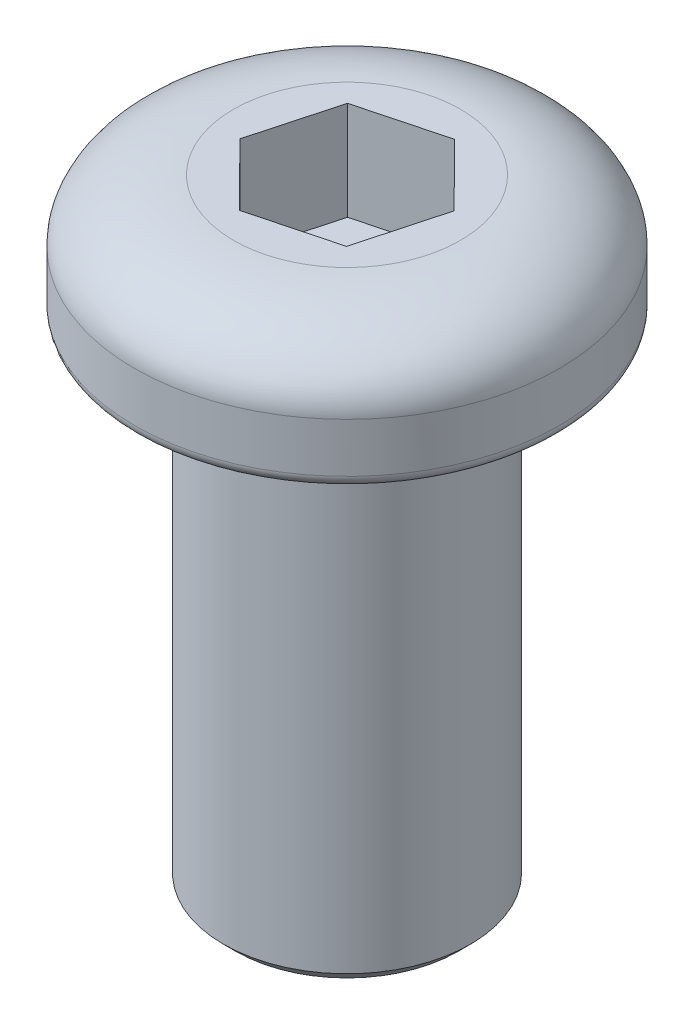
ISO-10303-21;
HEADER;
FILE_DESCRIPTION(('STEP AP214'),'2;1');
FILE_NAME('part.step','',(''),(''),'','','');
FILE_SCHEMA(('AUTOMOTIVE_DESIGN { 1 0 10303 214 1 1 1 1 }'));
ENDSEC;
DATA;
#1=APPLICATION_CONTEXT('core data for automotive mechanical design processes');
#2=APPLICATION_PROTOCOL_DEFINITION('international standard','automotive_design',2000,#1);
#3=PRODUCT_CONTEXT('',#1,'mechanical');
#4=PRODUCT('Part','Part','',(#3));
#5=PRODUCT_RELATED_PRODUCT_CATEGORY('part','',(#4));
#6=PRODUCT_DEFINITION_FORMATION('','',#4);
#7=PRODUCT_DEFINITION_CONTEXT('part definition',#1,'design');
#8=PRODUCT_DEFINITION('design','',#6,#7);
#9=PRODUCT_DEFINITION_SHAPE('','',#8);
#10=(LENGTH_UNIT() NAMED_UNIT(*) SI_UNIT(.MILLI.,.METRE.));
#11=(NAMED_UNIT(*) PLANE_ANGLE_UNIT() SI_UNIT($,.RADIAN.));
#12=(NAMED_UNIT(*) SI_UNIT($,.STERADIAN.) SOLID_ANGLE_UNIT());
#13=UNCERTAINTY_MEASURE_WITH_UNIT(LENGTH_MEASURE(1.E-05),#10,'distance_accuracy_value','');
#14=(GEOMETRIC_REPRESENTATION_CONTEXT(3) GLOBAL_UNCERTAINTY_ASSIGNED_CONTEXT((#13)) GLOBAL_UNIT_ASSIGNED_CONTEXT((#10,
#11,#12)) REPRESENTATION_CONTEXT('',''));
#15=CARTESIAN_POINT('',(0.,0.,0.));
#16=DIRECTION('',(0.,0.,1.));
#17=DIRECTION('',(1.,0.,0.));
#18=AXIS2_PLACEMENT_3D('',#15,#16,#17);
#19=CARTESIAN_POINT('',(0.,20.,0.));
#20=DIRECTION('',(0.,-1.,0.));
#21=DIRECTION('',(0.,0.,-1.));
#22=AXIS2_PLACEMENT_3D('',#19,#20,#21);
#23=CYLINDRICAL_SURFACE('',#22,5.);
#24=CARTESIAN_POINT('',(0.,0.5,0.));
#25=DIRECTION('',(0.,1.,0.));
#26=DIRECTION('',(0.,0.,1.));
#27=AXIS2_PLACEMENT_3D('',#24,#25,#26);
#28=CIRCLE('',#27,5.);
#29=CARTESIAN_POINT('',(0.,0.5,5.));
#30=VERTEX_POINT('',#29);
#31=EDGE_CURVE('E57',#30,#30,#28,.T.);
#32=ORIENTED_EDGE('',*,*,#31,.T.);
#33=EDGE_LOOP('',(#32));
#34=FACE_BOUND('',#33,.T.);
#35=CARTESIAN_POINT('',(0.,20.,0.));
#36=DIRECTION('',(0.,1.,0.));
#37=DIRECTION('',(0.,0.,1.));
#38=AXIS2_PLACEMENT_3D('',#35,#36,#37);
#39=CIRCLE('',#38,5.);
#40=CARTESIAN_POINT('',(0.,20.,5.));
#41=VERTEX_POINT('',#40);
#42=EDGE_CURVE('E155',#41,#41,#39,.T.);
#43=ORIENTED_EDGE('',*,*,#42,.F.);
#44=EDGE_LOOP('',(#43));
#45=FACE_BOUND('',#44,.T.);
#46=ADVANCED_FACE('F48',(#34,#45),#23,.T.);
#47=CARTESIAN_POINT('',(0.,0.,0.));
#48=DIRECTION('',(0.,1.,0.));
#49=DIRECTION('',(0.,0.,1.));
#50=AXIS2_PLACEMENT_3D('',#47,#48,#49);
#51=PLANE('',#50);
#52=CARTESIAN_POINT('',(0.,0.,0.));
#53=DIRECTION('',(0.,1.,0.));
#54=DIRECTION('',(0.,0.,1.));
#55=AXIS2_PLACEMENT_3D('',#52,#53,#54);
#56=CIRCLE('',#55,4.5);
#57=CARTESIAN_POINT('',(0.,0.,4.5));
#58=VERTEX_POINT('',#57);
#59=EDGE_CURVE('E13',#58,#58,#56,.F.);
#60=ORIENTED_EDGE('',*,*,#59,.T.);
#61=EDGE_LOOP('',(#60));
#62=FACE_BOUND('',#61,.T.);
#63=ADVANCED_FACE('F200',(#62),#51,.F.);
#64=CARTESIAN_POINT('',(0.,25.,0.));
#65=DIRECTION('',(0.,-1.,0.));
#66=DIRECTION('',(0.,0.,-1.));
#67=AXIS2_PLACEMENT_3D('',#64,#65,#66);
#68=CYLINDRICAL_SURFACE('',#67,8.6);
#69=CARTESIAN_POINT('',(0.,20.5,0.));
#70=DIRECTION('',(0.,1.,0.));
#71=DIRECTION('',(0.,0.,1.));
#72=AXIS2_PLACEMENT_3D('',#69,#70,#71);
#73=CIRCLE('',#72,8.6);
#74=CARTESIAN_POINT('',(0.,20.5,8.6));
#75=VERTEX_POINT('',#74);
#76=EDGE_CURVE('E311',#75,#75,#73,.T.);
#77=ORIENTED_EDGE('',*,*,#76,.T.);
#78=EDGE_LOOP('',(#77));
#79=FACE_BOUND('',#78,.T.);
#80=CARTESIAN_POINT('',(0.,22.5,8.6));
#81=CARTESIAN_POINT('',(1.125737358671,22.5,8.6));
#82=CARTESIAN_POINT('',(2.25103181368176,22.5,8.37616501595429));
#83=CARTESIAN_POINT('',(4.33112322299778,22.5,7.51456294323984));
#84=CARTESIAN_POINT('',(5.28510179805401,22.5,6.87713483835461));
#85=CARTESIAN_POINT('',(6.8771348383546,22.5,5.28510179805401));
#86=CARTESIAN_POINT('',(7.51456294323973,22.5,4.33112322299805));
#87=CARTESIAN_POINT('',(8.37616501595441,22.5,2.25103181368149));
#88=CARTESIAN_POINT('',(8.6,22.5,1.12573735866948));
#89=CARTESIAN_POINT('',(8.6,22.5,-1.12573735866948));
#90=CARTESIAN_POINT('',(8.37616501595424,22.5,-2.2510318136819));
#91=CARTESIAN_POINT('',(7.51456294323989,22.5,-4.33112322299765));
#92=CARTESIAN_POINT('',(6.87713483835462,22.5,-5.285101798054));
#93=CARTESIAN_POINT('',(5.28510179805399,22.5,-6.87713483835462));
#94=CARTESIAN_POINT('',(4.33112322299776,22.5,-7.51456294323984));
#95=CARTESIAN_POINT('',(2.2510318136818,22.5,-8.37616501595428));
#96=CARTESIAN_POINT('',(1.12573735866948,22.5,-8.6));
#97=CARTESIAN_POINT('',(-1.12573735866947,22.5,-8.6));
#98=CARTESIAN_POINT('',(-2.25103181368148,22.5,-8.37616501595441));
#99=CARTESIAN_POINT('',(-4.33112322299804,22.5,-7.51456294323973));
#100=CARTESIAN_POINT('',(-5.28510179805426,22.5,-6.87713483835436));
#101=CARTESIAN_POINT('',(-6.87713483835436,22.5,-5.28510179805425));
#102=CARTESIAN_POINT('',(-7.51456294323978,22.5,-4.3311232229979));
#103=CARTESIAN_POINT('',(-8.37616501595434,22.5,-2.25103181368166));
#104=CARTESIAN_POINT('',(-8.6,22.5,-1.12573735866946));
#105=CARTESIAN_POINT('',(-8.6,22.5,1.12573735866949));
#106=CARTESIAN_POINT('',(-8.3761650159543,22.5,2.25103181368175));
#107=CARTESIAN_POINT('',(-7.51456294323984,22.5,4.33112322299777));
#108=CARTESIAN_POINT('',(-6.87713483835444,22.5,5.28510179805417));
#109=CARTESIAN_POINT('',(-5.28510179805421,22.5,6.87713483835441));
#110=CARTESIAN_POINT('',(-4.33112322299779,22.5,7.51456294323983));
#111=CARTESIAN_POINT('',(-2.25103181368177,22.5,8.37616501595429));
#112=CARTESIAN_POINT('',(-1.125737358671,22.5,8.6));
#113=CARTESIAN_POINT('',(0.,22.5,8.6));
#114=(BOUNDED_CURVE() B_SPLINE_CURVE(3,(#80,#81,#82,#83,#84,#85,#86,#87,#88,#89,#90,#91,#92,#93,
#94,#95,#96,#97,#98,#99,#100,#101,#102,#103,#104,#105,#106,#107,#108,#109,#110,#111,#112,#113),
.UNSPECIFIED.,.T.,.F.) B_SPLINE_CURVE_WITH_KNOTS((4,2,2,2,2,2,2,2,2,2,2,2,2,2,2,2,4),(0.,
0.392699081698724,0.785398163397448,1.17809724509617,1.5707963267949,1.96349540849362,
2.35619449019234,2.74889357189107,3.14159265358979,3.53429173528852,3.92699081698724,
4.31968989868597,4.71238898038469,5.10508806208341,5.49778714378214,5.89048622548086,
6.28318530717959),
.UNSPECIFIED.) CURVE() GEOMETRIC_REPRESENTATION_ITEM() RATIONAL_B_SPLINE_CURVE((0.999999999999999,
0.999999999999999,0.999999999999999,0.999999999999999,0.999999999999999,0.999999999999999,
0.999999999999999,0.999999999999999,0.999999999999999,0.999999999999999,0.999999999999999,
0.999999999999999,0.999999999999999,0.999999999999999,0.999999999999999,0.999999999999999,
0.999999999999999,0.999999999999999,0.999999999999999,0.999999999999999,0.999999999999999,
0.999999999999999,0.999999999999999,0.999999999999999,0.999999999999999,0.999999999999999,
0.999999999999999,0.999999999999999,0.999999999999999,0.999999999999999,0.999999999999999,
0.999999999999999,0.999999999999999,0.999999999999999)) REPRESENTATION_ITEM(''));
#115=CARTESIAN_POINT('',(0.,22.5,8.6));
#116=VERTEX_POINT('',#115);
#117=EDGE_CURVE('E321',#116,#116,#114,.F.);
#118=ORIENTED_EDGE('',*,*,#117,.T.);
#119=EDGE_LOOP('',(#118));
#120=FACE_BOUND('',#119,.T.);
#121=ADVANCED_FACE('F189',(#79,#120),#68,.T.);
#122=CARTESIAN_POINT('',(0.,25.,0.));
#123=DIRECTION('',(0.,1.,0.));
#124=DIRECTION('',(0.,0.,1.));
#125=AXIS2_PLACEMENT_3D('',#122,#123,#124);
#126=PLANE('',#125);
#127=DIRECTION('',(0.966917920556033,0.,-0.255087700423987));
#128=VECTOR('',#127,1.);
#129=CARTESIAN_POINT('',(-0.932225060476934,25.,3.42614308466806));
#130=LINE('',#129,#128);
#131=CARTESIAN_POINT('',(-0.932225060476934,25.,3.42614308466806));
#132=VERTEX_POINT('',#131);
#133=CARTESIAN_POINT('',(2.50101441808445,25.,2.52040212675154));
#134=VERTEX_POINT('',#133);
#135=EDGE_CURVE('E64',#132,#134,#130,.T.);
#136=ORIENTED_EDGE('',*,*,#135,.F.);
#137=DIRECTION('',(0.704371389038143,0.,0.709831632363955));
#138=VECTOR('',#137,1.);
#139=CARTESIAN_POINT('',(-3.43323947856139,25.,0.905740957916521));
#140=LINE('',#139,#138);
#141=CARTESIAN_POINT('',(-3.43323947856139,25.,0.905740957916521));
#142=VERTEX_POINT('',#141);
#143=EDGE_CURVE('E151',#142,#132,#140,.T.);
#144=ORIENTED_EDGE('',*,*,#143,.F.);
#145=DIRECTION('',(-0.262546531517889,0.,0.964919332787941));
#146=VECTOR('',#145,1.);
#147=CARTESIAN_POINT('',(-2.50101441808445,25.,-2.52040212675154));
#148=LINE('',#147,#146);
#149=CARTESIAN_POINT('',(-2.50101441808445,25.,-2.52040212675154));
#150=VERTEX_POINT('',#149);
#151=EDGE_CURVE('E148',#150,#142,#148,.T.);
#152=ORIENTED_EDGE('',*,*,#151,.F.);
#153=DIRECTION('',(-0.966917920556033,0.,0.255087700423987));
#154=VECTOR('',#153,1.);
#155=CARTESIAN_POINT('',(0.932225060476934,25.,-3.42614308466806));
#156=LINE('',#155,#154);
#157=CARTESIAN_POINT('',(0.932225060476934,25.,-3.42614308466806));
#158=VERTEX_POINT('',#157);
#159=EDGE_CURVE('E112',#158,#150,#156,.T.);
#160=ORIENTED_EDGE('',*,*,#159,.F.);
#161=DIRECTION('',(-0.704371389038143,0.,-0.709831632363955));
#162=VECTOR('',#161,1.);
#163=CARTESIAN_POINT('',(3.43323947856139,25.,-0.905740957916521));
#164=LINE('',#163,#162);
#165=CARTESIAN_POINT('',(3.43323947856139,25.,-0.905740957916521));
#166=VERTEX_POINT('',#165);
#167=EDGE_CURVE('E144',#166,#158,#164,.T.);
#168=ORIENTED_EDGE('',*,*,#167,.F.);
#169=DIRECTION('',(0.262546531517889,0.,-0.964919332787941));
#170=VECTOR('',#169,1.);
#171=CARTESIAN_POINT('',(2.50101441808445,25.,2.52040212675154));
#172=LINE('',#171,#170);
#173=EDGE_CURVE('E141',#134,#166,#172,.T.);
#174=ORIENTED_EDGE('',*,*,#173,.F.);
#175=EDGE_LOOP('',(#136,#144,#152,#160,#168,#174));
#176=FACE_BOUND('',#175,.T.);
#177=CARTESIAN_POINT('',(0.,25.,4.6));
#178=CARTESIAN_POINT('',(-0.0752656575314665,25.,4.60000012177592));
#179=CARTESIAN_POINT('',(-0.150529809695449,25.,4.59812937693995));
#180=CARTESIAN_POINT('',(-0.30087351396799,25.,4.59068164564769));
#181=CARTESIAN_POINT('',(-0.375953069039884,25.,4.58510471908178));
#182=CARTESIAN_POINT('',(-0.525749785277858,25.,4.57027997990893));
#183=CARTESIAN_POINT('',(-0.600466939880982,25.,4.56103210107162));
#184=CARTESIAN_POINT('',(-0.749362114299666,25.,4.53890078901402));
#185=CARTESIAN_POINT('',(-0.823540124567928,25.,4.52601729157343));
#186=CARTESIAN_POINT('',(-0.971179967374798,25.,4.496649903959));
#187=CARTESIAN_POINT('',(-1.04464179991341,25.,4.48016601378515));
#188=CARTESIAN_POINT('',(-1.19067231721078,25.,4.44363294615111));
#189=CARTESIAN_POINT('',(-1.26324101772408,25.,4.42358383167683));
#190=CARTESIAN_POINT('',(-1.40730821199914,25.,4.37995544725056));
#191=CARTESIAN_POINT('',(-1.47880672504622,25.,4.35637624099701));
#192=CARTESIAN_POINT('',(-1.62055672479532,25.,4.30572276416426));
#193=CARTESIAN_POINT('',(-1.6908081913274,25.,4.27864843711288));
#194=CARTESIAN_POINT('',(-1.82987938643145,25.,4.22104326199095));
#195=CARTESIAN_POINT('',(-1.89869911500342,25.,4.1905124139204));
#196=CARTESIAN_POINT('',(-2.03474891811077,25.,4.12609744468302));
#197=CARTESIAN_POINT('',(-2.10197901831572,25.,4.09221337771035));
#198=CARTESIAN_POINT('',(-2.23469983442638,25.,4.02119241469102));
#199=CARTESIAN_POINT('',(-2.30019051892725,25.,3.98405545996599));
#200=CARTESIAN_POINT('',(-2.42928246928898,25.,3.90662906885067));
#201=CARTESIAN_POINT('',(-2.49288370175225,25.,3.86633957678241));
#202=CARTESIAN_POINT('',(-2.61804670925419,25.,3.78270832891208));
#203=CARTESIAN_POINT('',(-2.67960848429286,25.,3.73936657311001));
#204=CARTESIAN_POINT('',(-2.80054249297582,25.,3.64973095946562));
#205=CARTESIAN_POINT('',(-2.85991476527913,25.,3.60343715378569));
#206=CARTESIAN_POINT('',(-2.97631963684663,25.,3.50799765414422));
#207=CARTESIAN_POINT('',(-3.03335227830445,25.,3.4588520116522));
#208=CARTESIAN_POINT('',(-3.14492795559905,25.,3.35780892467047));
#209=CARTESIAN_POINT('',(-3.19947095119027,25.,3.30591143572598));
#210=CARTESIAN_POINT('',(-3.30591143572598,25.,3.19947095119024));
#211=CARTESIAN_POINT('',(-3.35780892467046,25.,3.144927955599));
#212=CARTESIAN_POINT('',(-3.45885201165217,25.,3.03335227830437));
#213=CARTESIAN_POINT('',(-3.50799765414418,25.,2.97631963684655));
#214=CARTESIAN_POINT('',(-3.60343715378565,25.,2.85991476527905));
#215=CARTESIAN_POINT('',(-3.64973095946558,25.,2.80054249297576));
#216=CARTESIAN_POINT('',(-3.73936657310996,25.,2.67960848429274));
#217=CARTESIAN_POINT('',(-3.78270832891202,25.,2.61804670925398));
#218=CARTESIAN_POINT('',(-3.86633957678239,25.,2.49288370175228));
#219=CARTESIAN_POINT('',(-3.9066290688507,25.,2.42928246928934));
#220=CARTESIAN_POINT('',(-3.98405545996591,25.,2.30019051892673));
#221=CARTESIAN_POINT('',(-4.02119241469077,25.,2.23469983442466));
#222=CARTESIAN_POINT('',(-4.09221337771058,25.,2.10197901831733));
#223=CARTESIAN_POINT('',(-4.12609744468388,25.,2.03474891811692));
#224=CARTESIAN_POINT('',(-4.19051241391954,25.,1.8986991149972));
#225=CARTESIAN_POINT('',(-4.22104326198772,25.,1.82987938640833));
#226=CARTESIAN_POINT('',(-4.27864843711612,25.,1.69080819135048));
#227=CARTESIAN_POINT('',(-4.30572276417634,25.,1.62055672488148));
#228=CARTESIAN_POINT('',(-4.35637624098494,25.,1.47880672495998));
#229=CARTESIAN_POINT('',(-4.3799554472055,25.,1.40730821167742));
#230=CARTESIAN_POINT('',(-4.4235838317219,25.,1.2632410180456));
#231=CARTESIAN_POINT('',(-4.44363294631931,25.,1.19067231841107));
#232=CARTESIAN_POINT('',(-4.48016601361695,25.,1.04464179871271));
#233=CARTESIAN_POINT('',(-4.49664990333126,25.,0.971179962894277));
#234=CARTESIAN_POINT('',(-4.52601729220118,25.,0.823540129047892));
#235=CARTESIAN_POINT('',(-4.5389007913568,25.,0.74936213101994));
#236=CARTESIAN_POINT('',(-4.56103209872888,25.,0.600466923160345));
#237=CARTESIAN_POINT('',(-4.57027997116578,25.,0.525749722877023));
#238=CARTESIAN_POINT('',(-4.58510472782477,25.,0.375953131438964));
#239=CARTESIAN_POINT('',(-4.5906816782767,25.,0.300873746843283));
#240=CARTESIAN_POINT('',(-4.59812934431042,25.,0.150529576815985));
#241=CARTESIAN_POINT('',(-4.6,25.,0.0752647884079963));
#242=CARTESIAN_POINT('',(-4.6,25.,-0.075264788407981));
#243=CARTESIAN_POINT('',(-4.59812934431042,25.,-0.150529576815969));
#244=CARTESIAN_POINT('',(-4.59068167827672,25.,-0.300873746843266));
#245=CARTESIAN_POINT('',(-4.58510472782479,25.,-0.375953131438945));
#246=CARTESIAN_POINT('',(-4.57027997116582,25.,-0.525749722877002));
#247=CARTESIAN_POINT('',(-4.56103209872893,25.,-0.600466923160323));
#248=CARTESIAN_POINT('',(-4.53890079135688,25.,-0.749362131019916));
#249=CARTESIAN_POINT('',(-4.52601729220127,25.,-0.823540129047868));
#250=CARTESIAN_POINT('',(-4.49664990333136,25.,-0.971179962894252));
#251=CARTESIAN_POINT('',(-4.48016601361706,25.,-1.04464179871269));
#252=CARTESIAN_POINT('',(-4.44363294631942,25.,-1.19067231841105));
#253=CARTESIAN_POINT('',(-4.42358383172201,25.,-1.26324101804558));
#254=CARTESIAN_POINT('',(-4.3799554472056,25.,-1.4073082116774));
#255=CARTESIAN_POINT('',(-4.35637624098503,25.,-1.47880672495997));
#256=CARTESIAN_POINT('',(-4.30572276417639,25.,-1.62055672488148));
#257=CARTESIAN_POINT('',(-4.27864843711614,25.,-1.69080819135048));
#258=CARTESIAN_POINT('',(-4.22104326198769,25.,-1.82987938640835));
#259=CARTESIAN_POINT('',(-4.19051241391948,25.,-1.89869911499722));
#260=CARTESIAN_POINT('',(-4.12609744468378,25.,-2.03474891811694));
#261=CARTESIAN_POINT('',(-4.09221337771047,25.,-2.10197901831735));
#262=CARTESIAN_POINT('',(-4.02119241469064,25.,-2.23469983442468));
#263=CARTESIAN_POINT('',(-3.98405545996578,25.,-2.30019051892675));
#264=CARTESIAN_POINT('',(-3.90662906885057,25.,-2.42928246928936));
#265=CARTESIAN_POINT('',(-3.86633957678226,25.,-2.49288370175229));
#266=CARTESIAN_POINT('',(-3.7827083289119,25.,-2.61804670925398));
#267=CARTESIAN_POINT('',(-3.73936657310986,25.,-2.67960848429273));
#268=CARTESIAN_POINT('',(-3.6497309594655,25.,-2.80054249297574));
#269=CARTESIAN_POINT('',(-3.60343715378558,25.,-2.85991476527903));
#270=CARTESIAN_POINT('',(-3.50799765414413,25.,-2.97631963684653));
#271=CARTESIAN_POINT('',(-3.45885201165213,25.,-3.03335227830436));
#272=CARTESIAN_POINT('',(-3.35780892467044,25.,-3.144927955599));
#273=CARTESIAN_POINT('',(-3.30591143572597,25.,-3.19947095119024));
#274=CARTESIAN_POINT('',(-3.19947095119027,25.,-3.30591143572599));
#275=CARTESIAN_POINT('',(-3.14492795559906,25.,-3.35780892467049));
#276=CARTESIAN_POINT('',(-3.03335227830446,25.,-3.45885201165222));
#277=CARTESIAN_POINT('',(-2.97631963684664,25.,-3.50799765414424));
#278=CARTESIAN_POINT('',(-2.85991476527915,25.,-3.6034371537857));
#279=CARTESIAN_POINT('',(-2.80054249297587,25.,-3.64973095946562));
#280=CARTESIAN_POINT('',(-2.67960848429285,25.,-3.73936657310998));
#281=CARTESIAN_POINT('',(-2.61804670925409,25.,-3.78270832891203));
#282=CARTESIAN_POINT('',(-2.49288370175239,25.,-3.86633957678238));
#283=CARTESIAN_POINT('',(-2.42928246928944,25.,-3.90662906885068));
#284=CARTESIAN_POINT('',(-2.30019051892682,25.,-3.98405545996586));
#285=CARTESIAN_POINT('',(-2.23469983442473,25.,-4.02119241469071));
#286=CARTESIAN_POINT('',(-2.10197901831738,25.,-4.09221337771052));
#287=CARTESIAN_POINT('',(-2.03474891811696,25.,-4.12609744468382));
#288=CARTESIAN_POINT('',(-1.89869911499722,25.,-4.1905124139195));
#289=CARTESIAN_POINT('',(-1.82987938640835,25.,-4.2210432619877));
#290=CARTESIAN_POINT('',(-1.69080819135047,25.,-4.27864843711614));
#291=CARTESIAN_POINT('',(-1.62055672488147,25.,-4.30572276417638));
#292=CARTESIAN_POINT('',(-1.47880672495996,25.,-4.35637624098501));
#293=CARTESIAN_POINT('',(-1.40730821167738,25.,-4.37995544720558));
#294=CARTESIAN_POINT('',(-1.26324101804557,25.,-4.423583831722));
#295=CARTESIAN_POINT('',(-1.19067231841103,25.,-4.4436329463194));
#296=CARTESIAN_POINT('',(-1.04464179871267,25.,-4.48016601361704));
#297=CARTESIAN_POINT('',(-0.971179962894238,25.,-4.49664990333134));
#298=CARTESIAN_POINT('',(-0.823540129047857,25.,-4.52601729220125));
#299=CARTESIAN_POINT('',(-0.749362131019907,25.,-4.53890079135686));
#300=CARTESIAN_POINT('',(-0.600466923160318,25.,-4.56103209872893));
#301=CARTESIAN_POINT('',(-0.525749722877001,25.,-4.57027997116582));
#302=CARTESIAN_POINT('',(-0.375953131438949,25.,-4.58510472782479));
#303=CARTESIAN_POINT('',(-0.30087374684327,25.,-4.59068167827672));
#304=CARTESIAN_POINT('',(-0.150529576815975,25.,-4.59812934431042));
#305=CARTESIAN_POINT('',(-0.0752647884079872,25.,-4.6));
#306=CARTESIAN_POINT('',(0.0752647884079895,25.,-4.6));
#307=CARTESIAN_POINT('',(0.150529576815978,25.,-4.59812934431042));
#308=CARTESIAN_POINT('',(0.300873746843277,25.,-4.5906816782767));
#309=CARTESIAN_POINT('',(0.375953131438958,25.,-4.58510472782476));
#310=CARTESIAN_POINT('',(0.525749722877017,25.,-4.57027997116577));
#311=CARTESIAN_POINT('',(0.600466923160337,25.,-4.56103209872887));
#312=CARTESIAN_POINT('',(0.749362131019932,25.,-4.53890079135678));
#313=CARTESIAN_POINT('',(0.823540129047885,25.,-4.52601729220116));
#314=CARTESIAN_POINT('',(0.971179962894271,25.,-4.49664990333123));
#315=CARTESIAN_POINT('',(1.0446417987127,25.,-4.48016601361693));
#316=CARTESIAN_POINT('',(1.19067231841107,25.,-4.44363294631928));
#317=CARTESIAN_POINT('',(1.2632410180456,25.,-4.42358383172188));
#318=CARTESIAN_POINT('',(1.40730821167742,25.,-4.37995544720548));
#319=CARTESIAN_POINT('',(1.47880672495999,25.,-4.35637624098491));
#320=CARTESIAN_POINT('',(1.62055672488149,25.,-4.30572276417632));
#321=CARTESIAN_POINT('',(1.69080819135049,25.,-4.27864843711611));
#322=CARTESIAN_POINT('',(1.82987938640835,25.,-4.22104326198772));
#323=CARTESIAN_POINT('',(1.89869911499722,25.,-4.19051241391955));
#324=CARTESIAN_POINT('',(2.03474891811693,25.,-4.1260974446839));
#325=CARTESIAN_POINT('',(2.10197901831734,25.,-4.0922133777106));
#326=CARTESIAN_POINT('',(2.23469983442467,25.,-4.0211924146908));
#327=CARTESIAN_POINT('',(2.30019051892674,25.,-3.98405545996595));
#328=CARTESIAN_POINT('',(2.42928246928934,25.,-3.90662906885075));
#329=CARTESIAN_POINT('',(2.49288370175228,25.,-3.86633957678243));
#330=CARTESIAN_POINT('',(2.61804670925397,25.,-3.78270832891206));
#331=CARTESIAN_POINT('',(2.67960848429272,25.,-3.73936657311));
#332=CARTESIAN_POINT('',(2.80054249297574,25.,-3.64973095946562));
#333=CARTESIAN_POINT('',(2.85991476527903,25.,-3.60343715378569));
#334=CARTESIAN_POINT('',(2.97631963684653,25.,-3.50799765414421));
#335=CARTESIAN_POINT('',(3.03335227830436,25.,-3.4588520116522));
#336=CARTESIAN_POINT('',(3.144927955599,25.,-3.35780892467048));
#337=CARTESIAN_POINT('',(3.19947095119024,25.,-3.30591143572598));
#338=CARTESIAN_POINT('',(3.30591143572599,25.,-3.19947095119026));
#339=CARTESIAN_POINT('',(3.3578089246705,25.,-3.14492795559903));
#340=CARTESIAN_POINT('',(3.45885201165224,25.,-3.0333522783044));
#341=CARTESIAN_POINT('',(3.50799765414426,25.,-2.97631963684658));
#342=CARTESIAN_POINT('',(3.60343715378574,25.,-2.85991476527908));
#343=CARTESIAN_POINT('',(3.64973095946568,25.,-2.80054249297578));
#344=CARTESIAN_POINT('',(3.73936657311006,25.,-2.67960848429276));
#345=CARTESIAN_POINT('',(3.78270832891211,25.,-2.618046709254));
#346=CARTESIAN_POINT('',(3.86633957678248,25.,-2.4928837017523));
#347=CARTESIAN_POINT('',(3.90662906885079,25.,-2.42928246928935));
#348=CARTESIAN_POINT('',(3.98405545996598,25.,-2.30019051892674));
#349=CARTESIAN_POINT('',(4.02119241469082,25.,-2.23469983442466));
#350=CARTESIAN_POINT('',(4.09221337771062,25.,-2.10197901831733));
#351=CARTESIAN_POINT('',(4.12609744468391,25.,-2.03474891811692));
#352=CARTESIAN_POINT('',(4.19051241391955,25.,-1.8986991149972));
#353=CARTESIAN_POINT('',(4.22104326198773,25.,-1.82987938640834));
#354=CARTESIAN_POINT('',(4.27864843711611,25.,-1.69080819135049));
#355=CARTESIAN_POINT('',(4.30572276417633,25.,-1.6205567248815));
#356=CARTESIAN_POINT('',(4.35637624098492,25.,-1.47880672496));
#357=CARTESIAN_POINT('',(4.37995544720548,25.,-1.40730821167744));
#358=CARTESIAN_POINT('',(4.42358383172188,25.,-1.26324101804563));
#359=CARTESIAN_POINT('',(4.44363294631928,25.,-1.19067231841109));
#360=CARTESIAN_POINT('',(4.48016601361693,25.,-1.04464179871273));
#361=CARTESIAN_POINT('',(4.49664990333123,25.,-0.971179962894294));
#362=CARTESIAN_POINT('',(4.52601729220116,25.,-0.823540129047904));
#363=CARTESIAN_POINT('',(4.53890079135678,25.,-0.749362131019949));
#364=CARTESIAN_POINT('',(4.56103209872887,25.,-0.60046692316035));
#365=CARTESIAN_POINT('',(4.57027997116577,25.,-0.525749722877027));
#366=CARTESIAN_POINT('',(4.58510472782476,25.,-0.375953131438964));
#367=CARTESIAN_POINT('',(4.5906816782767,25.,-0.300873746843281));
#368=CARTESIAN_POINT('',(4.59812934431042,25.,-0.15052957681598));
#369=CARTESIAN_POINT('',(4.6,25.,-0.0752647884079898));
#370=CARTESIAN_POINT('',(4.6,25.,0.0752647884079886));
#371=CARTESIAN_POINT('',(4.59812934431042,25.,0.150529576815977));
#372=CARTESIAN_POINT('',(4.5906816782767,25.,0.300873746843272));
#373=CARTESIAN_POINT('',(4.58510472782476,25.,0.37595313143895));
#374=CARTESIAN_POINT('',(4.57027997116577,25.,0.525749722877003));
#375=CARTESIAN_POINT('',(4.56103209872887,25.,0.600466923160321));
#376=CARTESIAN_POINT('',(4.53890079135678,25.,0.749362131019909));
#377=CARTESIAN_POINT('',(4.52601729220116,25.,0.823540129047859));
#378=CARTESIAN_POINT('',(4.49664990333123,25.,0.97117996289424));
#379=CARTESIAN_POINT('',(4.48016601361693,25.,1.04464179871267));
#380=CARTESIAN_POINT('',(4.44363294631928,25.,1.19067231841104));
#381=CARTESIAN_POINT('',(4.42358383172188,25.,1.26324101804557));
#382=CARTESIAN_POINT('',(4.37995544720548,25.,1.40730821167739));
#383=CARTESIAN_POINT('',(4.35637624098492,25.,1.47880672495996));
#384=CARTESIAN_POINT('',(4.30572276417633,25.,1.62055672488147));
#385=CARTESIAN_POINT('',(4.27864843711611,25.,1.69080819135047));
#386=CARTESIAN_POINT('',(4.22104326198773,25.,1.82987938640835));
#387=CARTESIAN_POINT('',(4.19051241391955,25.,1.89869911499722));
#388=CARTESIAN_POINT('',(4.1260974446839,25.,2.03474891811696));
#389=CARTESIAN_POINT('',(4.0922133777106,25.,2.10197901831737));
#390=CARTESIAN_POINT('',(4.02119241469079,25.,2.2346998344247));
#391=CARTESIAN_POINT('',(3.98405545996593,25.,2.30019051892678));
#392=CARTESIAN_POINT('',(3.90662906885072,25.,2.42928246928939));
#393=CARTESIAN_POINT('',(3.8663395767824,25.,2.49288370175233));
#394=CARTESIAN_POINT('',(3.78270832891203,25.,2.61804670925402));
#395=CARTESIAN_POINT('',(3.73936657310997,25.,2.67960848429278));
#396=CARTESIAN_POINT('',(3.64973095946558,25.,2.80054249297579));
#397=CARTESIAN_POINT('',(3.60343715378565,25.,2.85991476527908));
#398=CARTESIAN_POINT('',(3.50799765414418,25.,2.97631963684657));
#399=CARTESIAN_POINT('',(3.45885201165216,25.,3.03335227830439));
#400=CARTESIAN_POINT('',(3.35780892467046,25.,3.14492795559902));
#401=CARTESIAN_POINT('',(3.30591143572597,25.,3.19947095119025));
#402=CARTESIAN_POINT('',(3.19947095119026,25.,3.30591143572599));
#403=CARTESIAN_POINT('',(3.14492795559904,25.,3.35780892467049));
#404=CARTESIAN_POINT('',(3.03335227830444,25.,3.45885201165222));
#405=CARTESIAN_POINT('',(2.97631963684663,25.,3.50799765414425));
#406=CARTESIAN_POINT('',(2.85991476527912,25.,3.60343715378573));
#407=CARTESIAN_POINT('',(2.80054249297581,25.,3.64973095946566));
#408=CARTESIAN_POINT('',(2.67960848429286,25.,3.73936657311006));
#409=CARTESIAN_POINT('',(2.61804670925419,25.,3.78270832891214));
#410=CARTESIAN_POINT('',(2.49288370175225,25.,3.86633957678248));
#411=CARTESIAN_POINT('',(2.42928246928898,25.,3.90662906885075));
#412=CARTESIAN_POINT('',(2.30019051892725,25.,3.98405545996607));
#413=CARTESIAN_POINT('',(2.23469983442638,25.,4.02119241469109));
#414=CARTESIAN_POINT('',(2.10197901831572,25.,4.09221337771042));
#415=CARTESIAN_POINT('',(2.03474891811077,25.,4.12609744468308));
#416=CARTESIAN_POINT('',(1.89869911500341,25.,4.19051241392044));
#417=CARTESIAN_POINT('',(1.82987938643144,25.,4.22104326199097));
#418=CARTESIAN_POINT('',(1.69080819132739,25.,4.27864843711286));
#419=CARTESIAN_POINT('',(1.62055672479531,25.,4.30572276416422));
#420=CARTESIAN_POINT('',(1.47880672504621,25.,4.35637624099695));
#421=CARTESIAN_POINT('',(1.40730821199913,25.,4.3799554472505));
#422=CARTESIAN_POINT('',(1.26324101772407,25.,4.42358383167676));
#423=CARTESIAN_POINT('',(1.19067231721078,25.,4.44363294615103));
#424=CARTESIAN_POINT('',(1.0446417999134,25.,4.48016601378508));
#425=CARTESIAN_POINT('',(0.971179967374793,25.,4.49664990395893));
#426=CARTESIAN_POINT('',(0.823540124567923,25.,4.52601729157337));
#427=CARTESIAN_POINT('',(0.749362114299662,25.,4.53890078901397));
#428=CARTESIAN_POINT('',(0.60046693988098,25.,4.56103210107158));
#429=CARTESIAN_POINT('',(0.525749785277857,25.,4.5702799799089));
#430=CARTESIAN_POINT('',(0.375953069039884,25.,4.58510471908176));
#431=CARTESIAN_POINT('',(0.30087351396799,25.,4.59068164564768));
#432=CARTESIAN_POINT('',(0.15052980969545,25.,4.59812937693995));
#433=CARTESIAN_POINT('',(0.0752656575314668,25.,4.60000012177592));
#434=CARTESIAN_POINT('',(0.,25.,4.6));
#435=B_SPLINE_CURVE_WITH_KNOTS('',3,(#177,#178,#179,#180,#181,#182,#183,#184,#185,#186,#187,
#188,#189,#190,#191,#192,#193,#194,#195,#196,#197,#198,#199,#200,#201,#202,#203,#204,#205,#206,
#207,#208,#209,#210,#211,#212,#213,#214,#215,#216,#217,#218,#219,#220,#221,#222,#223,#224,#225,
#226,#227,#228,#229,#230,#231,#232,#233,#234,#235,#236,#237,#238,#239,#240,#241,#242,#243,#244,
#245,#246,#247,#248,#249,#250,#251,#252,#253,#254,#255,#256,#257,#258,#259,#260,#261,#262,#263,
#264,#265,#266,#267,#268,#269,#270,#271,#272,#273,#274,#275,#276,#277,#278,#279,#280,#281,#282,
#283,#284,#285,#286,#287,#288,#289,#290,#291,#292,#293,#294,#295,#296,#297,#298,#299,#300,#301,
#302,#303,#304,#305,#306,#307,#308,#309,#310,#311,#312,#313,#314,#315,#316,#317,#318,#319,#320,
#321,#322,#323,#324,#325,#326,#327,#328,#329,#330,#331,#332,#333,#334,#335,#336,#337,#338,#339,
#340,#341,#342,#343,#344,#345,#346,#347,#348,#349,#350,#351,#352,#353,#354,#355,#356,#357,#358,
#359,#360,#361,#362,#363,#364,#365,#366,#367,#368,#369,#370,#371,#372,#373,#374,#375,#376,#377,
#378,#379,#380,#381,#382,#383,#384,#385,#386,#387,#388,#389,#390,#391,#392,#393,#394,#395,#396,
#397,#398,#399,#400,#401,#402,#403,#404,#405,#406,#407,#408,#409,#410,#411,#412,#413,#414,#415,
#416,#417,#418,#419,#420,#421,#422,#423,#424,#425,#426,#427,#428,#429,#430,#431,#432,#433,#434),
.UNSPECIFIED.,.F.,.F.,(4,2,2,2,2,2,2,2,2,2,2,2,2,2,2,2,2,2,2,2,2,2,2,2,2,2,2,2,2,2,2,2,2,2,2,2,
2,2,2,2,2,2,2,2,2,2,2,2,2,2,2,2,2,2,2,2,2,2,2,2,2,2,2,2,2,2,2,2,2,2,2,2,2,2,2,2,2,2,2,2,2,2,2,2,
2,2,2,2,2,2,2,2,2,2,2,2,2,2,2,2,2,2,2,2,2,2,2,2,2,2,2,2,2,2,2,2,2,2,2,2,2,2,2,2,2,2,2,2,4),(0.,
0.225771594671024,0.451539541054551,0.677311560871118,0.9030875690197,1.12886357716825,
1.3546355969847,1.58040354336805,1.80617513803881,2.03194673270961,2.25771467909304,
2.48348669890959,2.70926270705823,2.93503871520686,3.16081073502342,3.38657868140683,
3.61235027607763,3.83812187074843,4.06388981713185,4.28966183694841,4.51543784509705,
4.74121385324568,4.96698587306222,5.19275381944563,5.41852541411641,5.64429700878719,
5.8700649551706,6.09583697498715,6.32161298313578,6.54738899128442,6.77316101110098,
6.9989289574844,7.22470055215519,7.45047214682598,7.6762400932094,7.90201211302595,
8.12778812117458,8.35356412932321,8.57933614913977,8.8051040955232,9.03087569019403,
9.25664728486485,9.48241523124828,9.70818725106481,9.93396325921343,10.159739267362,
10.3855112871786,10.611279233562,10.8370508282328,11.0628224229036,11.288590369287,
11.5143623891035,11.7401383972521,11.9659144054008,12.1916864252173,12.4174543716008,
12.6432259662716,12.8689975609424,13.0947655073258,13.3205375271424,13.546313535291,
13.7720895434397,13.9978615632562,14.2236295096396,14.4494011043104,14.6751726989812,
14.9009406453646,15.1267126651812,15.3524886733298,15.5782646814784,15.804036701295,
16.0298046476784,16.2555762423492,16.48134783702,16.7071157834034,16.9328878032199,
17.1586638113685,17.3844398195172,17.6102118393337,17.8359797857172,18.061751380388,
18.2875229750588,18.5132909214423,18.7390629412588,18.9648389494075,19.1906149575561,
19.4163869773726,19.642154923756,19.8679265184268,20.0936981130976,20.319466059481,
20.5452380792975,20.7710140874462,20.9967900955948,21.2225621154114,21.4483300617948,
21.6741016564656,21.8998732511364,22.1256411975198,22.3514132173363,22.577189225485,
22.8029652336336,23.0287372534502,23.2545051998336,23.4802767945044,23.7060483891752,
23.9318163355586,24.1575883553751,24.3833643635238,24.6091403716724,24.834912391489,
25.0606803378724,25.2864519325432,25.512223527214,25.7379914735974,25.963763493414,
26.1895395015626,26.4153155097112,26.6410875295278,26.8668554759112,27.092627070582,
27.3183986652527,27.5441666116361,27.7699386314525,27.9957146396011,28.2214906477497,
28.4472626675662,28.6730306139498,28.8988022086208),.UNSPECIFIED.);
#436=CARTESIAN_POINT('',(0.,25.,4.6));
#437=VERTEX_POINT('',#436);
#438=EDGE_CURVE('E167',#437,#437,#435,.F.);
#439=ORIENTED_EDGE('',*,*,#438,.T.);
#440=EDGE_LOOP('',(#439));
#441=FACE_BOUND('',#440,.T.);
#442=ADVANCED_FACE('F178',(#176,#441),#126,.T.);
#443=CARTESIAN_POINT('',(0.,20.,0.));
#444=DIRECTION('',(0.,1.,0.));
#445=DIRECTION('',(0.,0.,1.));
#446=AXIS2_PLACEMENT_3D('',#443,#444,#445);
#447=PLANE('',#446);
#448=CARTESIAN_POINT('',(0.,20.,0.));
#449=DIRECTION('',(0.,1.,0.));
#450=DIRECTION('',(0.,0.,1.));
#451=AXIS2_PLACEMENT_3D('',#448,#449,#450);
#452=CIRCLE('',#451,8.1);
#453=CARTESIAN_POINT('',(0.,20.,8.1));
#454=VERTEX_POINT('',#453);
#455=EDGE_CURVE('E320',#454,#454,#452,.F.);
#456=ORIENTED_EDGE('',*,*,#455,.T.);
#457=EDGE_LOOP('',(#456));
#458=FACE_BOUND('',#457,.T.);
#459=ORIENTED_EDGE('',*,*,#42,.T.);
#460=EDGE_LOOP('',(#459));
#461=FACE_BOUND('',#460,.T.);
#462=ADVANCED_FACE('F188',(#458,#461),#447,.F.);
#463=CARTESIAN_POINT('',(0.,25.,4.6));
#464=CARTESIAN_POINT('',(0.602138587196115,25.,4.6));
#465=CARTESIAN_POINT('',(1.20404027243438,25.,4.4802743108591));
#466=CARTESIAN_POINT('',(2.31664730532444,25.,4.01941738824474));
#467=CARTESIAN_POINT('',(2.82691491523829,25.,3.67846747167808));
#468=CARTESIAN_POINT('',(3.67846747167794,25.,2.82691491523816));
#469=CARTESIAN_POINT('',(4.01941738824462,25.,2.31664730532446));
#470=CARTESIAN_POINT('',(4.48027431085922,25.,1.20404027243436));
#471=CARTESIAN_POINT('',(4.6,25.,0.602138587195301));
#472=CARTESIAN_POINT('',(4.6,25.,-0.602138587195301));
#473=CARTESIAN_POINT('',(4.48027431085922,25.,-1.20404027243449));
#474=CARTESIAN_POINT('',(4.01941738824462,25.,-2.31664730532434));
#475=CARTESIAN_POINT('',(3.67846747167816,25.,-2.82691491523821));
#476=CARTESIAN_POINT('',(2.82691491523807,25.,-3.67846747167803));
#477=CARTESIAN_POINT('',(2.31664730532441,25.,-4.01941738824462));
#478=CARTESIAN_POINT('',(1.20404027243443,25.,-4.48027431085921));
#479=CARTESIAN_POINT('',(0.602138587195302,25.,-4.6));
#480=CARTESIAN_POINT('',(-0.602138587195301,25.,-4.6));
#481=CARTESIAN_POINT('',(-1.20404027243436,25.,-4.48027431085948));
#482=CARTESIAN_POINT('',(-2.31664730532446,25.,-4.01941738824436));
#483=CARTESIAN_POINT('',(-2.82691491523834,25.,-3.67846747167816));
#484=CARTESIAN_POINT('',(-3.6784674716779,25.,-2.82691491523807));
#485=CARTESIAN_POINT('',(-4.01941738824431,25.,-2.31664730532444));
#486=CARTESIAN_POINT('',(-4.48027431085953,25.,-1.20404027243439));
#487=CARTESIAN_POINT('',(-4.6,25.,-0.602138587195294));
#488=CARTESIAN_POINT('',(-4.6,25.,0.602138587195309));
#489=CARTESIAN_POINT('',(-4.48027431085927,25.,1.20404027243445));
#490=CARTESIAN_POINT('',(-4.01941738824457,25.,2.31664730532437));
#491=CARTESIAN_POINT('',(-3.67846747167795,25.,2.82691491523815));
#492=CARTESIAN_POINT('',(-2.8269149152383,25.,3.67846747167807));
#493=CARTESIAN_POINT('',(-2.31664730532444,25.,4.01941738824457));
#494=CARTESIAN_POINT('',(-1.20404027243439,25.,4.48027431085927));
#495=CARTESIAN_POINT('',(-0.602138587196116,25.,4.6));
#496=CARTESIAN_POINT('',(0.,25.,4.6));
#497=CARTESIAN_POINT('',(0.,25.,8.6));
#498=CARTESIAN_POINT('',(1.125737358671,25.,8.6));
#499=CARTESIAN_POINT('',(2.2510318136817,25.,8.37616501595436));
#500=CARTESIAN_POINT('',(4.33112322299784,25.,7.51456294323978));
#501=CARTESIAN_POINT('',(5.28510179805414,25.,6.87713483835474));
#502=CARTESIAN_POINT('',(6.87713483835448,25.,5.28510179805388));
#503=CARTESIAN_POINT('',(7.51456294323956,25.,4.33112322299811));
#504=CARTESIAN_POINT('',(8.37616501595458,25.,2.25103181368143));
#505=CARTESIAN_POINT('',(8.6,25.,1.12573735866948));
#506=CARTESIAN_POINT('',(8.6,25.,-1.12573735866948));
#507=CARTESIAN_POINT('',(8.37616501595405,25.,-2.2510318136817));
#508=CARTESIAN_POINT('',(7.51456294324008,25.,-4.33112322299785));
#509=CARTESIAN_POINT('',(6.87713483835462,25.,-5.285101798054));
#510=CARTESIAN_POINT('',(5.28510179805399,25.,-6.87713483835463));
#511=CARTESIAN_POINT('',(4.33112322299773,25.,-7.51456294324007));
#512=CARTESIAN_POINT('',(2.25103181368184,25.,-8.37616501595405));
#513=CARTESIAN_POINT('',(1.12573735866948,25.,-8.6));
#514=CARTESIAN_POINT('',(-1.12573735866947,25.,-8.6));
#515=CARTESIAN_POINT('',(-2.25103181368155,25.,-8.37616501595458));
#516=CARTESIAN_POINT('',(-4.33112322299797,25.,-7.51456294323956));
#517=CARTESIAN_POINT('',(-5.285101798054,25.,-6.87713483835409));
#518=CARTESIAN_POINT('',(-6.87713483835463,25.,-5.28510179805452));
#519=CARTESIAN_POINT('',(-7.51456294323991,25.,-4.33112322299769));
#520=CARTESIAN_POINT('',(-8.37616501595421,25.,-2.25103181368187));
#521=CARTESIAN_POINT('',(-8.6,25.,-1.12573735866946));
#522=CARTESIAN_POINT('',(-8.6,25.,1.12573735866949));
#523=CARTESIAN_POINT('',(-8.37616501595422,25.,2.25103181368146));
#524=CARTESIAN_POINT('',(-7.51456294323992,25.,4.33112322299806));
#525=CARTESIAN_POINT('',(-6.87713483835458,25.,5.28510179805404));
#526=CARTESIAN_POINT('',(-5.28510179805407,25.,6.87713483835454));
#527=CARTESIAN_POINT('',(-4.33112322299769,25.,7.51456294323991));
#528=CARTESIAN_POINT('',(-2.25103181368187,25.,8.37616501595421));
#529=CARTESIAN_POINT('',(-1.125737358671,25.,8.6));
#530=CARTESIAN_POINT('',(0.,25.,8.6));
#531=CARTESIAN_POINT('',(0.,22.5,8.6));
#532=CARTESIAN_POINT('',(1.125737358671,22.5,8.6));
#533=CARTESIAN_POINT('',(2.25103181368176,22.5,8.3761650159543));
#534=CARTESIAN_POINT('',(4.33112322299778,22.5,7.51456294323984));
#535=CARTESIAN_POINT('',(5.28510179805401,22.5,6.87713483835461));
#536=CARTESIAN_POINT('',(6.87713483835461,22.5,5.28510179805401));
#537=CARTESIAN_POINT('',(7.51456294323973,22.5,4.33112322299805));
#538=CARTESIAN_POINT('',(8.37616501595441,22.5,2.25103181368149));
#539=CARTESIAN_POINT('',(8.6,22.5,1.12573735866948));
#540=CARTESIAN_POINT('',(8.6,22.5,-1.12573735866948));
#541=CARTESIAN_POINT('',(8.37616501595424,22.5,-2.2510318136819));
#542=CARTESIAN_POINT('',(7.51456294323989,22.5,-4.33112322299765));
#543=CARTESIAN_POINT('',(6.87713483835462,22.5,-5.285101798054));
#544=CARTESIAN_POINT('',(5.28510179805399,22.5,-6.87713483835463));
#545=CARTESIAN_POINT('',(4.33112322299776,22.5,-7.51456294323984));
#546=CARTESIAN_POINT('',(2.2510318136818,22.5,-8.37616501595428));
#547=CARTESIAN_POINT('',(1.12573735866948,22.5,-8.6));
#548=CARTESIAN_POINT('',(-1.12573735866947,22.5,-8.6));
#549=CARTESIAN_POINT('',(-2.25103181368148,22.5,-8.37616501595441));
#550=CARTESIAN_POINT('',(-4.33112322299804,22.5,-7.51456294323973));
#551=CARTESIAN_POINT('',(-5.28510179805426,22.5,-6.87713483835436));
#552=CARTESIAN_POINT('',(-6.87713483835436,22.5,-5.28510179805425));
#553=CARTESIAN_POINT('',(-7.51456294323978,22.5,-4.3311232229979));
#554=CARTESIAN_POINT('',(-8.37616501595434,22.5,-2.25103181368166));
#555=CARTESIAN_POINT('',(-8.6,22.5,-1.12573735866946));
#556=CARTESIAN_POINT('',(-8.6,22.5,1.12573735866949));
#557=CARTESIAN_POINT('',(-8.3761650159543,22.5,2.25103181368175));
#558=CARTESIAN_POINT('',(-7.51456294323984,22.5,4.33112322299777));
#559=CARTESIAN_POINT('',(-6.87713483835445,22.5,5.28510179805417));
#560=CARTESIAN_POINT('',(-5.28510179805421,22.5,6.87713483835441));
#561=CARTESIAN_POINT('',(-4.33112322299779,22.5,7.51456294323983));
#562=CARTESIAN_POINT('',(-2.25103181368177,22.5,8.37616501595429));
#563=CARTESIAN_POINT('',(-1.125737358671,22.5,8.6));
#564=CARTESIAN_POINT('',(0.,22.5,8.6));
#565=(BOUNDED_SURFACE() B_SPLINE_SURFACE(2,3,((#463,#464,#465,#466,#467,#468,#469,#470,#471,
#472,#473,#474,#475,#476,#477,#478,#479,#480,#481,#482,#483,#484,#485,#486,#487,#488,#489,#490,
#491,#492,#493,#494,#495,#496),(#497,#498,#499,#500,#501,#502,#503,#504,#505,#506,#507,#508,
#509,#510,#511,#512,#513,#514,#515,#516,#517,#518,#519,#520,#521,#522,#523,#524,#525,#526,#527,
#528,#529,#530),(#531,#532,#533,#534,#535,#536,#537,#538,#539,#540,#541,#542,#543,#544,#545,
#546,#547,#548,#549,#550,#551,#552,#553,#554,#555,#556,#557,#558,#559,#560,#561,#562,#563,
#564)),.UNSPECIFIED.,.F.,.T.,.F.) B_SPLINE_SURFACE_WITH_KNOTS((3,3),(4,2,2,2,2,2,2,2,2,2,2,2,2,
2,2,2,4),(0.,1.),(0.,0.392699081698724,0.785398163397448,1.17809724509617,1.5707963267949,
1.96349540849362,2.35619449019234,2.74889357189107,3.14159265358979,3.53429173528852,
3.92699081698724,4.31968989868597,4.71238898038469,5.10508806208341,5.49778714378214,
5.89048622548086,6.28318530717959),
.UNSPECIFIED.) GEOMETRIC_REPRESENTATION_ITEM() RATIONAL_B_SPLINE_SURFACE(((1.,1.,1.,1.,1.,1.,1.,
1.,1.,1.,1.,1.,1.,1.,1.,1.,1.,1.,1.,1.,1.,1.,1.,1.,1.,1.,1.,1.,1.,1.,1.,1.,1.,1.),
(0.707106781186548,0.707106781186548,0.707106781186548,0.707106781186548,0.707106781186548,
0.707106781186548,0.707106781186548,0.707106781186548,0.707106781186548,0.707106781186548,
0.707106781186548,0.707106781186548,0.707106781186548,0.707106781186548,0.707106781186548,
0.707106781186548,0.707106781186548,0.707106781186548,0.707106781186548,0.707106781186548,
0.707106781186548,0.707106781186548,0.707106781186548,0.707106781186548,0.707106781186548,
0.707106781186548,0.707106781186548,0.707106781186548,0.707106781186548,0.707106781186548,
0.707106781186548,0.707106781186548,0.707106781186548,0.707106781186548),(1.,1.,1.,1.,1.,1.,1.,
1.,1.,1.,1.,1.,1.,1.,1.,1.,1.,1.,1.,1.,1.,1.,1.,1.,1.,1.,1.,1.,1.,1.,1.,1.,1.,1.))) REPRESENTATION_ITEM('') SURFACE());
#566=ORIENTED_EDGE('',*,*,#117,.F.);
#567=EDGE_LOOP('',(#566));
#568=FACE_BOUND('',#567,.T.);
#569=ORIENTED_EDGE('',*,*,#438,.F.);
#570=EDGE_LOOP('',(#569));
#571=FACE_BOUND('',#570,.T.);
#572=ADVANCED_FACE('F195',(#568,#571),#565,.T.);
#573=CARTESIAN_POINT('',(-0.932225060476934,21.,3.42614308466806));
#574=DIRECTION('',(0.255087700423987,0.,0.966917920556033));
#575=DIRECTION('',(0.966917920556033,0.,-0.255087700423987));
#576=AXIS2_PLACEMENT_3D('',#573,#574,#575);
#577=PLANE('',#576);
#578=ORIENTED_EDGE('',*,*,#135,.T.);
#579=DIRECTION('',(0.,1.,0.));
#580=VECTOR('',#579,1.);
#581=CARTESIAN_POINT('',(2.50101441808445,21.,2.52040212675154));
#582=LINE('',#581,#580);
#583=CARTESIAN_POINT('',(2.50101441808445,21.,2.52040212675154));
#584=VERTEX_POINT('',#583);
#585=EDGE_CURVE('E94',#584,#134,#582,.T.);
#586=ORIENTED_EDGE('',*,*,#585,.F.);
#587=DIRECTION('',(0.966917920556033,0.,-0.255087700423987));
#588=VECTOR('',#587,1.);
#589=CARTESIAN_POINT('',(-0.932225060476934,21.,3.42614308466806));
#590=LINE('',#589,#588);
#591=CARTESIAN_POINT('',(-0.932225060476934,21.,3.42614308466806));
#592=VERTEX_POINT('',#591);
#593=EDGE_CURVE('E153',#592,#584,#590,.T.);
#594=ORIENTED_EDGE('',*,*,#593,.F.);
#595=DIRECTION('',(0.,1.,0.));
#596=VECTOR('',#595,1.);
#597=CARTESIAN_POINT('',(-0.932225060476934,21.,3.42614308466806));
#598=LINE('',#597,#596);
#599=EDGE_CURVE('E72',#592,#132,#598,.T.);
#600=ORIENTED_EDGE('',*,*,#599,.T.);
#601=EDGE_LOOP('',(#578,#586,#594,#600));
#602=FACE_BOUND('',#601,.T.);
#603=ADVANCED_FACE('F191',(#602),#577,.F.);
#604=CARTESIAN_POINT('',(-3.43323947856139,21.,0.905740957916521));
#605=DIRECTION('',(-0.709831632363955,0.,0.704371389038143));
#606=DIRECTION('',(0.704371389038143,0.,0.709831632363955));
#607=AXIS2_PLACEMENT_3D('',#604,#605,#606);
#608=PLANE('',#607);
#609=ORIENTED_EDGE('',*,*,#143,.T.);
#610=ORIENTED_EDGE('',*,*,#599,.F.);
#611=DIRECTION('',(0.704371389038143,0.,0.709831632363955));
#612=VECTOR('',#611,1.);
#613=CARTESIAN_POINT('',(-3.43323947856139,21.,0.905740957916521));
#614=LINE('',#613,#612);
#615=CARTESIAN_POINT('',(-3.43323947856139,21.,0.905740957916521));
#616=VERTEX_POINT('',#615);
#617=EDGE_CURVE('E125',#616,#592,#614,.T.);
#618=ORIENTED_EDGE('',*,*,#617,.F.);
#619=DIRECTION('',(0.,1.,0.));
#620=VECTOR('',#619,1.);
#621=CARTESIAN_POINT('',(-3.43323947856139,21.,0.905740957916521));
#622=LINE('',#621,#620);
#623=EDGE_CURVE('E117',#616,#142,#622,.T.);
#624=ORIENTED_EDGE('',*,*,#623,.T.);
#625=EDGE_LOOP('',(#609,#610,#618,#624));
#626=FACE_BOUND('',#625,.T.);
#627=ADVANCED_FACE('F369',(#626),#608,.F.);
#628=CARTESIAN_POINT('',(-2.50101441808445,21.,-2.52040212675154));
#629=DIRECTION('',(-0.964919332787941,0.,-0.262546531517889));
#630=DIRECTION('',(-0.262546531517889,0.,0.964919332787941));
#631=AXIS2_PLACEMENT_3D('',#628,#629,#630);
#632=PLANE('',#631);
#633=ORIENTED_EDGE('',*,*,#151,.T.);
#634=ORIENTED_EDGE('',*,*,#623,.F.);
#635=DIRECTION('',(-0.262546531517889,0.,0.964919332787941));
#636=VECTOR('',#635,1.);
#637=CARTESIAN_POINT('',(-2.50101441808445,21.,-2.52040212675154));
#638=LINE('',#637,#636);
#639=CARTESIAN_POINT('',(-2.50101441808445,21.,-2.52040212675154));
#640=VERTEX_POINT('',#639);
#641=EDGE_CURVE('E121',#640,#616,#638,.T.);
#642=ORIENTED_EDGE('',*,*,#641,.F.);
#643=DIRECTION('',(0.,1.,0.));
#644=VECTOR('',#643,1.);
#645=CARTESIAN_POINT('',(-2.50101441808445,21.,-2.52040212675154));
#646=LINE('',#645,#644);
#647=EDGE_CURVE('E105',#640,#150,#646,.T.);
#648=ORIENTED_EDGE('',*,*,#647,.T.);
#649=EDGE_LOOP('',(#633,#634,#642,#648));
#650=FACE_BOUND('',#649,.T.);
#651=ADVANCED_FACE('F122',(#650),#632,.F.);
#652=CARTESIAN_POINT('',(0.932225060476934,21.,-3.42614308466806));
#653=DIRECTION('',(-0.255087700423987,0.,-0.966917920556033));
#654=DIRECTION('',(-0.966917920556033,0.,0.255087700423987));
#655=AXIS2_PLACEMENT_3D('',#652,#653,#654);
#656=PLANE('',#655);
#657=ORIENTED_EDGE('',*,*,#159,.T.);
#658=ORIENTED_EDGE('',*,*,#647,.F.);
#659=DIRECTION('',(-0.966917920556033,0.,0.255087700423987));
#660=VECTOR('',#659,1.);
#661=CARTESIAN_POINT('',(0.932225060476934,21.,-3.42614308466806));
#662=LINE('',#661,#660);
#663=CARTESIAN_POINT('',(0.932225060476934,21.,-3.42614308466806));
#664=VERTEX_POINT('',#663);
#665=EDGE_CURVE('E109',#664,#640,#662,.T.);
#666=ORIENTED_EDGE('',*,*,#665,.F.);
#667=DIRECTION('',(0.,1.,0.));
#668=VECTOR('',#667,1.);
#669=CARTESIAN_POINT('',(0.932225060476934,21.,-3.42614308466806));
#670=LINE('',#669,#668);
#671=EDGE_CURVE('E118',#664,#158,#670,.T.);
#672=ORIENTED_EDGE('',*,*,#671,.T.);
#673=EDGE_LOOP('',(#657,#658,#666,#672));
#674=FACE_BOUND('',#673,.T.);
#675=ADVANCED_FACE('F107',(#674),#656,.F.);
#676=CARTESIAN_POINT('',(3.43323947856139,21.,-0.905740957916521));
#677=DIRECTION('',(0.709831632363955,0.,-0.704371389038143));
#678=DIRECTION('',(-0.704371389038143,0.,-0.709831632363955));
#679=AXIS2_PLACEMENT_3D('',#676,#677,#678);
#680=PLANE('',#679);
#681=ORIENTED_EDGE('',*,*,#167,.T.);
#682=ORIENTED_EDGE('',*,*,#671,.F.);
#683=DIRECTION('',(-0.704371389038143,0.,-0.709831632363955));
#684=VECTOR('',#683,1.);
#685=CARTESIAN_POINT('',(3.43323947856139,21.,-0.905740957916521));
#686=LINE('',#685,#684);
#687=CARTESIAN_POINT('',(3.43323947856139,21.,-0.905740957916521));
#688=VERTEX_POINT('',#687);
#689=EDGE_CURVE('E131',#688,#664,#686,.T.);
#690=ORIENTED_EDGE('',*,*,#689,.F.);
#691=DIRECTION('',(0.,1.,0.));
#692=VECTOR('',#691,1.);
#693=CARTESIAN_POINT('',(3.43323947856139,21.,-0.905740957916521));
#694=LINE('',#693,#692);
#695=EDGE_CURVE('E159',#688,#166,#694,.T.);
#696=ORIENTED_EDGE('',*,*,#695,.T.);
#697=EDGE_LOOP('',(#681,#682,#690,#696));
#698=FACE_BOUND('',#697,.T.);
#699=ADVANCED_FACE('F387',(#698),#680,.F.);
#700=CARTESIAN_POINT('',(2.50101441808445,21.,2.52040212675154));
#701=DIRECTION('',(0.964919332787941,0.,0.262546531517889));
#702=DIRECTION('',(0.262546531517889,0.,-0.964919332787942));
#703=AXIS2_PLACEMENT_3D('',#700,#701,#702);
#704=PLANE('',#703);
#705=ORIENTED_EDGE('',*,*,#173,.T.);
#706=ORIENTED_EDGE('',*,*,#695,.F.);
#707=DIRECTION('',(0.262546531517889,0.,-0.964919332787941));
#708=VECTOR('',#707,1.);
#709=CARTESIAN_POINT('',(2.50101441808445,21.,2.52040212675154));
#710=LINE('',#709,#708);
#711=EDGE_CURVE('E134',#584,#688,#710,.T.);
#712=ORIENTED_EDGE('',*,*,#711,.F.);
#713=ORIENTED_EDGE('',*,*,#585,.T.);
#714=EDGE_LOOP('',(#705,#706,#712,#713));
#715=FACE_BOUND('',#714,.T.);
#716=ADVANCED_FACE('F394',(#715),#704,.F.);
#717=CARTESIAN_POINT('',(0.,21.,0.));
#718=DIRECTION('',(0.,1.,0.));
#719=DIRECTION('',(0.,0.,1.));
#720=AXIS2_PLACEMENT_3D('',#717,#718,#719);
#721=PLANE('',#720);
#722=ORIENTED_EDGE('',*,*,#593,.T.);
#723=ORIENTED_EDGE('',*,*,#711,.T.);
#724=ORIENTED_EDGE('',*,*,#689,.T.);
#725=ORIENTED_EDGE('',*,*,#665,.T.);
#726=ORIENTED_EDGE('',*,*,#641,.T.);
#727=ORIENTED_EDGE('',*,*,#617,.T.);
#728=EDGE_LOOP('',(#722,#723,#724,#725,#726,#727));
#729=FACE_BOUND('',#728,.T.);
#730=ADVANCED_FACE('F128',(#729),#721,.T.);
#731=CARTESIAN_POINT('',(0.,20.5,0.));
#732=DIRECTION('',(0.,1.,0.));
#733=DIRECTION('',(0.,0.,1.));
#734=AXIS2_PLACEMENT_3D('',#731,#732,#733);
#735=TOROIDAL_SURFACE('',#734,8.1,0.5);
#736=ORIENTED_EDGE('',*,*,#455,.F.);
#737=EDGE_LOOP('',(#736));
#738=FACE_BOUND('',#737,.T.);
#739=ORIENTED_EDGE('',*,*,#76,.F.);
#740=EDGE_LOOP('',(#739));
#741=FACE_BOUND('',#740,.T.);
#742=ADVANCED_FACE('F229',(#738,#741),#735,.T.);
#743=CARTESIAN_POINT('',(0.,0.5,0.));
#744=DIRECTION('',(0.,1.,0.));
#745=DIRECTION('',(0.,0.,1.));
#746=AXIS2_PLACEMENT_3D('',#743,#744,#745);
#747=CONICAL_SURFACE('',#746,5.,0.785398163397451);
#748=ORIENTED_EDGE('',*,*,#59,.F.);
#749=EDGE_LOOP('',(#748));
#750=FACE_BOUND('',#749,.T.);
#751=ORIENTED_EDGE('',*,*,#31,.F.);
#752=EDGE_LOOP('',(#751));
#753=FACE_BOUND('',#752,.T.);
#754=ADVANCED_FACE('F50',(#750,#753),#747,.T.);
#755=CLOSED_SHELL('',(#46,#63,#121,#442,#462,#572,#603,#627,#651,#675,#699,#716,#730,#742,#754));
#756=MANIFOLD_SOLID_BREP('B2',#755);
#757=ADVANCED_BREP_SHAPE_REPRESENTATION('',(#18,#756),#14);
#758=SHAPE_DEFINITION_REPRESENTATION(#9,#757);
ENDSEC;
END-ISO-10303-21;
